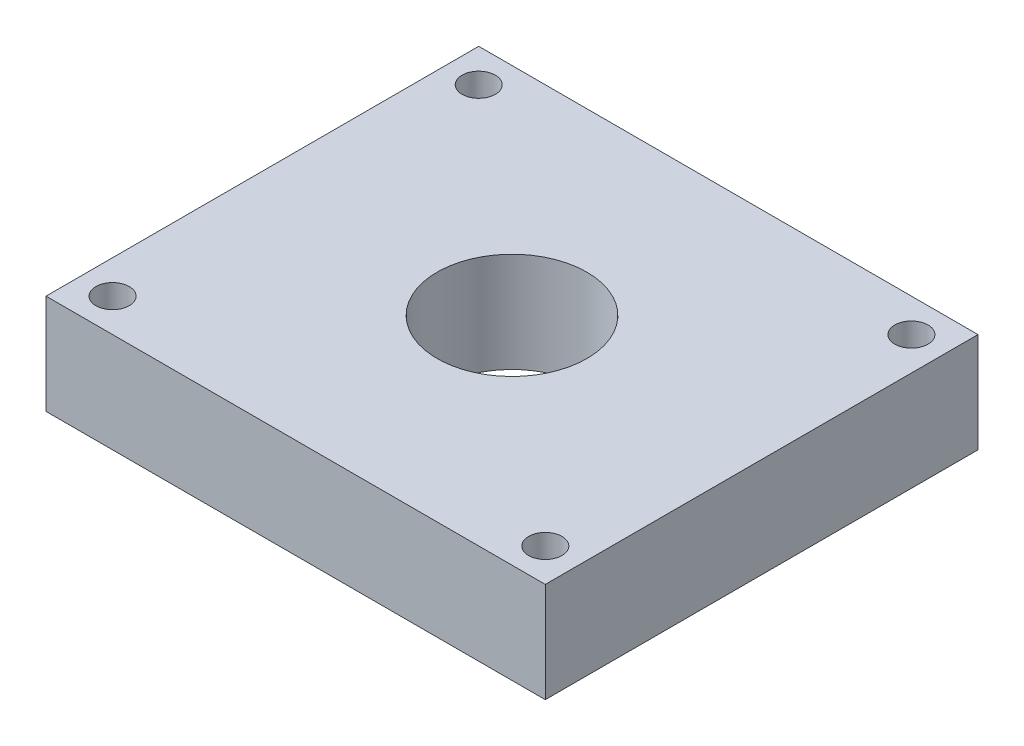
ISO-10303-21;
HEADER;
FILE_DESCRIPTION(('STEP AP214'),'2;1');
FILE_NAME('part.step','',(''),(''),'','','');
FILE_SCHEMA(('AUTOMOTIVE_DESIGN { 1 0 10303 214 1 1 1 1 }'));
ENDSEC;
DATA;
#1=APPLICATION_CONTEXT('core data for automotive mechanical design processes');
#2=APPLICATION_PROTOCOL_DEFINITION('international standard','automotive_design',2000,#1);
#3=PRODUCT_CONTEXT('',#1,'mechanical');
#4=PRODUCT('Part','Part','',(#3));
#5=PRODUCT_RELATED_PRODUCT_CATEGORY('part','',(#4));
#6=PRODUCT_DEFINITION_FORMATION('','',#4);
#7=PRODUCT_DEFINITION_CONTEXT('part definition',#1,'design');
#8=PRODUCT_DEFINITION('design','',#6,#7);
#9=PRODUCT_DEFINITION_SHAPE('','',#8);
#10=(LENGTH_UNIT() NAMED_UNIT(*) SI_UNIT(.MILLI.,.METRE.));
#11=(NAMED_UNIT(*) PLANE_ANGLE_UNIT() SI_UNIT($,.RADIAN.));
#12=(NAMED_UNIT(*) SI_UNIT($,.STERADIAN.) SOLID_ANGLE_UNIT());
#13=UNCERTAINTY_MEASURE_WITH_UNIT(LENGTH_MEASURE(1.E-05),#10,'distance_accuracy_value','');
#14=(GEOMETRIC_REPRESENTATION_CONTEXT(3) GLOBAL_UNCERTAINTY_ASSIGNED_CONTEXT((#13)) GLOBAL_UNIT_ASSIGNED_CONTEXT((#10,
#11,#12)) REPRESENTATION_CONTEXT('',''));
#15=CARTESIAN_POINT('',(0.,0.,0.));
#16=DIRECTION('',(0.,0.,1.));
#17=DIRECTION('',(1.,0.,0.));
#18=AXIS2_PLACEMENT_3D('',#15,#16,#17);
#19=CARTESIAN_POINT('',(0.,19.05,0.));
#20=DIRECTION('',(0.,-1.,0.));
#21=DIRECTION('',(0.,0.,-1.));
#22=AXIS2_PLACEMENT_3D('',#19,#20,#21);
#23=PLANE('',#22);
#24=DIRECTION('',(0.,0.,-1.));
#25=VECTOR('',#24,1.);
#26=CARTESIAN_POINT('',(47.625,19.05,41.275));
#27=LINE('',#26,#25);
#28=CARTESIAN_POINT('',(47.625,19.05,41.275));
#29=VERTEX_POINT('',#28);
#30=CARTESIAN_POINT('',(47.625,19.05,-41.275));
#31=VERTEX_POINT('',#30);
#32=EDGE_CURVE('E89',#29,#31,#27,.T.);
#33=ORIENTED_EDGE('',*,*,#32,.T.);
#34=DIRECTION('',(-1.,0.,0.));
#35=VECTOR('',#34,1.);
#36=CARTESIAN_POINT('',(-47.625,19.05,-41.275));
#37=LINE('',#36,#35);
#38=CARTESIAN_POINT('',(-47.625,19.05,-41.275));
#39=VERTEX_POINT('',#38);
#40=EDGE_CURVE('E84',#31,#39,#37,.T.);
#41=ORIENTED_EDGE('',*,*,#40,.T.);
#42=DIRECTION('',(0.,0.,1.));
#43=VECTOR('',#42,1.);
#44=CARTESIAN_POINT('',(-47.625,19.05,41.275));
#45=LINE('',#44,#43);
#46=CARTESIAN_POINT('',(-47.625,19.05,41.275));
#47=VERTEX_POINT('',#46);
#48=EDGE_CURVE('E87',#39,#47,#45,.T.);
#49=ORIENTED_EDGE('',*,*,#48,.T.);
#50=DIRECTION('',(1.,0.,0.));
#51=VECTOR('',#50,1.);
#52=CARTESIAN_POINT('',(-47.625,19.05,41.275));
#53=LINE('',#52,#51);
#54=EDGE_CURVE('E54',#47,#29,#53,.T.);
#55=ORIENTED_EDGE('',*,*,#54,.T.);
#56=EDGE_LOOP('',(#33,#41,#49,#55));
#57=FACE_BOUND('',#56,.T.);
#58=CARTESIAN_POINT('',(0.,19.05,0.));
#59=DIRECTION('',(0.,1.,0.));
#60=DIRECTION('',(0.,0.,1.));
#61=AXIS2_PLACEMENT_3D('',#58,#59,#60);
#62=CIRCLE('',#61,14.2875);
#63=CARTESIAN_POINT('',(0.,19.05,-14.2875));
#64=VERTEX_POINT('',#63);
#65=EDGE_CURVE('E104',#64,#64,#62,.T.);
#66=ORIENTED_EDGE('',*,*,#65,.F.);
#67=EDGE_LOOP('',(#66));
#68=FACE_BOUND('',#67,.T.);
#69=CARTESIAN_POINT('',(-41.275,19.05,-34.925));
#70=DIRECTION('',(0.,1.,0.));
#71=DIRECTION('',(0.,0.,-1.));
#72=AXIS2_PLACEMENT_3D('',#69,#70,#71);
#73=CIRCLE('',#72,3.17500000000001);
#74=CARTESIAN_POINT('',(-41.275,19.05,-38.1));
#75=VERTEX_POINT('',#74);
#76=EDGE_CURVE('E119',#75,#75,#73,.T.);
#77=ORIENTED_EDGE('',*,*,#76,.F.);
#78=EDGE_LOOP('',(#77));
#79=FACE_BOUND('',#78,.T.);
#80=CARTESIAN_POINT('',(-41.275,19.05,34.925));
#81=DIRECTION('',(0.,1.,0.));
#82=DIRECTION('',(0.,0.,1.));
#83=AXIS2_PLACEMENT_3D('',#80,#81,#82);
#84=CIRCLE('',#83,3.17500000000001);
#85=CARTESIAN_POINT('',(-41.275,19.05,31.75));
#86=VERTEX_POINT('',#85);
#87=EDGE_CURVE('E125',#86,#86,#84,.T.);
#88=ORIENTED_EDGE('',*,*,#87,.F.);
#89=EDGE_LOOP('',(#88));
#90=FACE_BOUND('',#89,.T.);
#91=CARTESIAN_POINT('',(41.275,19.05,-34.925));
#92=DIRECTION('',(0.,1.,0.));
#93=DIRECTION('',(0.,0.,1.));
#94=AXIS2_PLACEMENT_3D('',#91,#92,#93);
#95=CIRCLE('',#94,3.17500000000001);
#96=CARTESIAN_POINT('',(41.275,19.05,-38.1));
#97=VERTEX_POINT('',#96);
#98=EDGE_CURVE('E131',#97,#97,#95,.T.);
#99=ORIENTED_EDGE('',*,*,#98,.F.);
#100=EDGE_LOOP('',(#99));
#101=FACE_BOUND('',#100,.T.);
#102=CARTESIAN_POINT('',(41.275,19.05,34.925));
#103=DIRECTION('',(0.,1.,0.));
#104=DIRECTION('',(0.,0.,-1.));
#105=AXIS2_PLACEMENT_3D('',#102,#103,#104);
#106=CIRCLE('',#105,3.17500000000001);
#107=CARTESIAN_POINT('',(41.275,19.05,31.75));
#108=VERTEX_POINT('',#107);
#109=EDGE_CURVE('E137',#108,#108,#106,.T.);
#110=ORIENTED_EDGE('',*,*,#109,.F.);
#111=EDGE_LOOP('',(#110));
#112=FACE_BOUND('',#111,.T.);
#113=ADVANCED_FACE('F37',(#57,#68,#79,#90,#101,#112),#23,.F.);
#114=CARTESIAN_POINT('',(0.,0.,0.));
#115=DIRECTION('',(0.,-1.,0.));
#116=DIRECTION('',(0.,0.,-1.));
#117=AXIS2_PLACEMENT_3D('',#114,#115,#116);
#118=PLANE('',#117);
#119=CARTESIAN_POINT('',(41.275,0.,-34.925));
#120=DIRECTION('',(0.,1.,0.));
#121=DIRECTION('',(0.,0.,1.));
#122=AXIS2_PLACEMENT_3D('',#119,#120,#121);
#123=CIRCLE('',#122,3.17500000000001);
#124=CARTESIAN_POINT('',(41.275,0.,-38.1));
#125=VERTEX_POINT('',#124);
#126=EDGE_CURVE('E134',#125,#125,#123,.T.);
#127=ORIENTED_EDGE('',*,*,#126,.T.);
#128=EDGE_LOOP('',(#127));
#129=FACE_BOUND('',#128,.T.);
#130=CARTESIAN_POINT('',(-41.275,0.,-34.925));
#131=DIRECTION('',(0.,1.,0.));
#132=DIRECTION('',(0.,0.,-1.));
#133=AXIS2_PLACEMENT_3D('',#130,#131,#132);
#134=CIRCLE('',#133,3.17500000000001);
#135=CARTESIAN_POINT('',(-41.275,0.,-38.1));
#136=VERTEX_POINT('',#135);
#137=EDGE_CURVE('E122',#136,#136,#134,.T.);
#138=ORIENTED_EDGE('',*,*,#137,.T.);
#139=EDGE_LOOP('',(#138));
#140=FACE_BOUND('',#139,.T.);
#141=DIRECTION('',(0.,0.,-1.));
#142=VECTOR('',#141,1.);
#143=CARTESIAN_POINT('',(47.625,0.,41.275));
#144=LINE('',#143,#142);
#145=CARTESIAN_POINT('',(47.625,0.,41.275));
#146=VERTEX_POINT('',#145);
#147=CARTESIAN_POINT('',(47.625,0.,-41.275));
#148=VERTEX_POINT('',#147);
#149=EDGE_CURVE('E101',#146,#148,#144,.T.);
#150=ORIENTED_EDGE('',*,*,#149,.F.);
#151=DIRECTION('',(1.,0.,0.));
#152=VECTOR('',#151,1.);
#153=CARTESIAN_POINT('',(-47.625,0.,41.275));
#154=LINE('',#153,#152);
#155=CARTESIAN_POINT('',(-47.625,0.,41.275));
#156=VERTEX_POINT('',#155);
#157=EDGE_CURVE('E77',#156,#146,#154,.T.);
#158=ORIENTED_EDGE('',*,*,#157,.F.);
#159=DIRECTION('',(0.,0.,1.));
#160=VECTOR('',#159,1.);
#161=CARTESIAN_POINT('',(-47.625,0.,41.275));
#162=LINE('',#161,#160);
#163=CARTESIAN_POINT('',(-47.625,0.,-41.275));
#164=VERTEX_POINT('',#163);
#165=EDGE_CURVE('E71',#164,#156,#162,.T.);
#166=ORIENTED_EDGE('',*,*,#165,.F.);
#167=DIRECTION('',(-1.,0.,0.));
#168=VECTOR('',#167,1.);
#169=CARTESIAN_POINT('',(-47.625,0.,-41.275));
#170=LINE('',#169,#168);
#171=EDGE_CURVE('E93',#148,#164,#170,.T.);
#172=ORIENTED_EDGE('',*,*,#171,.F.);
#173=EDGE_LOOP('',(#150,#158,#166,#172));
#174=FACE_BOUND('',#173,.T.);
#175=CARTESIAN_POINT('',(0.,0.,0.));
#176=DIRECTION('',(0.,1.,0.));
#177=DIRECTION('',(0.,0.,1.));
#178=AXIS2_PLACEMENT_3D('',#175,#176,#177);
#179=CIRCLE('',#178,14.2875);
#180=CARTESIAN_POINT('',(0.,0.,-14.2875));
#181=VERTEX_POINT('',#180);
#182=EDGE_CURVE('E116',#181,#181,#179,.T.);
#183=ORIENTED_EDGE('',*,*,#182,.T.);
#184=EDGE_LOOP('',(#183));
#185=FACE_BOUND('',#184,.T.);
#186=CARTESIAN_POINT('',(-41.275,0.,34.925));
#187=DIRECTION('',(0.,1.,0.));
#188=DIRECTION('',(0.,0.,1.));
#189=AXIS2_PLACEMENT_3D('',#186,#187,#188);
#190=CIRCLE('',#189,3.17500000000001);
#191=CARTESIAN_POINT('',(-41.275,0.,31.75));
#192=VERTEX_POINT('',#191);
#193=EDGE_CURVE('E128',#192,#192,#190,.T.);
#194=ORIENTED_EDGE('',*,*,#193,.T.);
#195=EDGE_LOOP('',(#194));
#196=FACE_BOUND('',#195,.T.);
#197=CARTESIAN_POINT('',(41.275,0.,34.925));
#198=DIRECTION('',(0.,1.,0.));
#199=DIRECTION('',(0.,0.,-1.));
#200=AXIS2_PLACEMENT_3D('',#197,#198,#199);
#201=CIRCLE('',#200,3.17500000000001);
#202=CARTESIAN_POINT('',(41.275,0.,31.75));
#203=VERTEX_POINT('',#202);
#204=EDGE_CURVE('E140',#203,#203,#201,.T.);
#205=ORIENTED_EDGE('',*,*,#204,.T.);
#206=EDGE_LOOP('',(#205));
#207=FACE_BOUND('',#206,.T.);
#208=ADVANCED_FACE('F112',(#129,#140,#174,#185,#196,#207),#118,.T.);
#209=CARTESIAN_POINT('',(47.625,19.05,41.275));
#210=DIRECTION('',(-1.,0.,0.));
#211=DIRECTION('',(0.,0.,1.));
#212=AXIS2_PLACEMENT_3D('',#209,#210,#211);
#213=PLANE('',#212);
#214=ORIENTED_EDGE('',*,*,#149,.T.);
#215=DIRECTION('',(0.,-1.,0.));
#216=VECTOR('',#215,1.);
#217=CARTESIAN_POINT('',(47.625,19.05,-41.275));
#218=LINE('',#217,#216);
#219=EDGE_CURVE('E11',#31,#148,#218,.T.);
#220=ORIENTED_EDGE('',*,*,#219,.F.);
#221=ORIENTED_EDGE('',*,*,#32,.F.);
#222=DIRECTION('',(0.,-1.,0.));
#223=VECTOR('',#222,1.);
#224=CARTESIAN_POINT('',(47.625,19.05,41.275));
#225=LINE('',#224,#223);
#226=EDGE_CURVE('E97',#29,#146,#225,.T.);
#227=ORIENTED_EDGE('',*,*,#226,.T.);
#228=EDGE_LOOP('',(#214,#220,#221,#227));
#229=FACE_BOUND('',#228,.T.);
#230=ADVANCED_FACE('F39',(#229),#213,.F.);
#231=CARTESIAN_POINT('',(-47.625,19.05,-41.275));
#232=DIRECTION('',(0.,0.,1.));
#233=DIRECTION('',(1.,0.,0.));
#234=AXIS2_PLACEMENT_3D('',#231,#232,#233);
#235=PLANE('',#234);
#236=ORIENTED_EDGE('',*,*,#171,.T.);
#237=DIRECTION('',(0.,-1.,0.));
#238=VECTOR('',#237,1.);
#239=CARTESIAN_POINT('',(-47.625,19.05,-41.275));
#240=LINE('',#239,#238);
#241=EDGE_CURVE('E46',#39,#164,#240,.T.);
#242=ORIENTED_EDGE('',*,*,#241,.F.);
#243=ORIENTED_EDGE('',*,*,#40,.F.);
#244=ORIENTED_EDGE('',*,*,#219,.T.);
#245=EDGE_LOOP('',(#236,#242,#243,#244));
#246=FACE_BOUND('',#245,.T.);
#247=ADVANCED_FACE('F92',(#246),#235,.F.);
#248=CARTESIAN_POINT('',(-47.625,19.05,41.275));
#249=DIRECTION('',(1.,0.,0.));
#250=DIRECTION('',(0.,0.,-1.));
#251=AXIS2_PLACEMENT_3D('',#248,#249,#250);
#252=PLANE('',#251);
#253=ORIENTED_EDGE('',*,*,#165,.T.);
#254=DIRECTION('',(0.,-1.,0.));
#255=VECTOR('',#254,1.);
#256=CARTESIAN_POINT('',(-47.625,19.05,41.275));
#257=LINE('',#256,#255);
#258=EDGE_CURVE('E94',#47,#156,#257,.T.);
#259=ORIENTED_EDGE('',*,*,#258,.F.);
#260=ORIENTED_EDGE('',*,*,#48,.F.);
#261=ORIENTED_EDGE('',*,*,#241,.T.);
#262=EDGE_LOOP('',(#253,#259,#260,#261));
#263=FACE_BOUND('',#262,.T.);
#264=ADVANCED_FACE('F95',(#263),#252,.F.);
#265=CARTESIAN_POINT('',(-47.625,19.05,41.275));
#266=DIRECTION('',(0.,0.,-1.));
#267=DIRECTION('',(-1.,0.,0.));
#268=AXIS2_PLACEMENT_3D('',#265,#266,#267);
#269=PLANE('',#268);
#270=ORIENTED_EDGE('',*,*,#157,.T.);
#271=ORIENTED_EDGE('',*,*,#226,.F.);
#272=ORIENTED_EDGE('',*,*,#54,.F.);
#273=ORIENTED_EDGE('',*,*,#258,.T.);
#274=EDGE_LOOP('',(#270,#271,#272,#273));
#275=FACE_BOUND('',#274,.T.);
#276=ADVANCED_FACE('F109',(#275),#269,.F.);
#277=CARTESIAN_POINT('',(0.,19.05,0.));
#278=DIRECTION('',(0.,-1.,0.));
#279=DIRECTION('',(0.,0.,-1.));
#280=AXIS2_PLACEMENT_3D('',#277,#278,#279);
#281=CYLINDRICAL_SURFACE('',#280,14.2875);
#282=CARTESIAN_POINT('',(0.,19.05,-14.2875));
#283=CARTESIAN_POINT('',(0.,18.8515625,-14.2875));
#284=CARTESIAN_POINT('',(0.,18.653125,-14.2875));
#285=CARTESIAN_POINT('',(0.,18.25625,-14.2875));
#286=CARTESIAN_POINT('',(0.,18.0578125,-14.2875));
#287=CARTESIAN_POINT('',(0.,17.6609375,-14.2875));
#288=CARTESIAN_POINT('',(0.,17.4625,-14.2875));
#289=CARTESIAN_POINT('',(0.,17.065625,-14.2875));
#290=CARTESIAN_POINT('',(0.,16.8671875,-14.2875));
#291=CARTESIAN_POINT('',(0.,16.4703125,-14.2875));
#292=CARTESIAN_POINT('',(0.,16.271875,-14.2875));
#293=CARTESIAN_POINT('',(0.,15.875,-14.2875));
#294=CARTESIAN_POINT('',(0.,15.6765625,-14.2875));
#295=CARTESIAN_POINT('',(0.,15.2796875,-14.2875));
#296=CARTESIAN_POINT('',(0.,15.08125,-14.2875));
#297=CARTESIAN_POINT('',(0.,14.684375,-14.2875));
#298=CARTESIAN_POINT('',(0.,14.4859375,-14.2875));
#299=CARTESIAN_POINT('',(0.,14.0890625,-14.2875));
#300=CARTESIAN_POINT('',(0.,13.890625,-14.2875));
#301=CARTESIAN_POINT('',(0.,13.49375,-14.2875));
#302=CARTESIAN_POINT('',(0.,13.2953125,-14.2875));
#303=CARTESIAN_POINT('',(0.,12.8984375,-14.2875));
#304=CARTESIAN_POINT('',(0.,12.7,-14.2875));
#305=CARTESIAN_POINT('',(0.,12.303125,-14.2875));
#306=CARTESIAN_POINT('',(0.,12.1046875,-14.2875));
#307=CARTESIAN_POINT('',(0.,11.7078125,-14.2875));
#308=CARTESIAN_POINT('',(0.,11.509375,-14.2875));
#309=CARTESIAN_POINT('',(0.,11.1125,-14.2875));
#310=CARTESIAN_POINT('',(0.,10.9140625,-14.2875));
#311=CARTESIAN_POINT('',(0.,10.5171875,-14.2875));
#312=CARTESIAN_POINT('',(0.,10.31875,-14.2875));
#313=CARTESIAN_POINT('',(0.,9.921875,-14.2875));
#314=CARTESIAN_POINT('',(0.,9.7234375,-14.2875));
#315=CARTESIAN_POINT('',(0.,9.3265625,-14.2875));
#316=CARTESIAN_POINT('',(0.,9.128125,-14.2875));
#317=CARTESIAN_POINT('',(0.,8.73125,-14.2875));
#318=CARTESIAN_POINT('',(0.,8.5328125,-14.2875));
#319=CARTESIAN_POINT('',(0.,8.1359375,-14.2875));
#320=CARTESIAN_POINT('',(0.,7.9375,-14.2875));
#321=CARTESIAN_POINT('',(0.,7.540625,-14.2875));
#322=CARTESIAN_POINT('',(0.,7.3421875,-14.2875));
#323=CARTESIAN_POINT('',(0.,6.9453125,-14.2875));
#324=CARTESIAN_POINT('',(0.,6.746875,-14.2875));
#325=CARTESIAN_POINT('',(0.,6.35,-14.2875));
#326=CARTESIAN_POINT('',(0.,6.1515625,-14.2875));
#327=CARTESIAN_POINT('',(0.,5.7546875,-14.2875));
#328=CARTESIAN_POINT('',(0.,5.55625,-14.2875));
#329=CARTESIAN_POINT('',(0.,5.159375,-14.2875));
#330=CARTESIAN_POINT('',(0.,4.9609375,-14.2875));
#331=CARTESIAN_POINT('',(0.,4.5640625,-14.2875));
#332=CARTESIAN_POINT('',(0.,4.365625,-14.2875));
#333=CARTESIAN_POINT('',(0.,3.96875,-14.2875));
#334=CARTESIAN_POINT('',(0.,3.7703125,-14.2875));
#335=CARTESIAN_POINT('',(0.,3.3734375,-14.2875));
#336=CARTESIAN_POINT('',(0.,3.175,-14.2875));
#337=CARTESIAN_POINT('',(0.,2.778125,-14.2875));
#338=CARTESIAN_POINT('',(0.,2.5796875,-14.2875));
#339=CARTESIAN_POINT('',(0.,2.1828125,-14.2875));
#340=CARTESIAN_POINT('',(0.,1.984375,-14.2875));
#341=CARTESIAN_POINT('',(0.,1.5875,-14.2875));
#342=CARTESIAN_POINT('',(0.,1.3890625,-14.2875));
#343=CARTESIAN_POINT('',(0.,0.992187500000001,-14.2875));
#344=CARTESIAN_POINT('',(0.,0.793750000000001,-14.2875));
#345=CARTESIAN_POINT('',(0.,0.396875,-14.2875));
#346=CARTESIAN_POINT('',(0.,0.1984375,-14.2875));
#347=CARTESIAN_POINT('',(0.,0.,-14.2875));
#348=B_SPLINE_CURVE_WITH_KNOTS('',3,(#282,#283,#284,#285,#286,#287,#288,#289,#290,#291,#292,
#293,#294,#295,#296,#297,#298,#299,#300,#301,#302,#303,#304,#305,#306,#307,#308,#309,#310,#311,
#312,#313,#314,#315,#316,#317,#318,#319,#320,#321,#322,#323,#324,#325,#326,#327,#328,#329,#330,
#331,#332,#333,#334,#335,#336,#337,#338,#339,#340,#341,#342,#343,#344,#345,#346,#347),
.UNSPECIFIED.,.F.,.F.,(4,2,2,2,2,2,2,2,2,2,2,2,2,2,2,2,2,2,2,2,2,2,2,2,2,2,2,2,2,2,2,2,4),(0.,
0.5953125,1.190625,1.7859375,2.38125,2.9765625,3.571875,4.1671875,4.7625,5.3578125,5.953125,
6.5484375,7.14375,7.7390625,8.334375,8.9296875,9.525,10.1203125,10.715625,11.3109375,11.90625,
12.5015625,13.096875,13.6921875,14.2875,14.8828125,15.478125,16.0734375,16.66875,17.2640625,
17.859375,18.4546875,19.05),.UNSPECIFIED.);
#349=EDGE_CURVE('BSEAM157',#64,#181,#348,.T.);
#350=ORIENTED_EDGE('',*,*,#65,.T.);
#351=ORIENTED_EDGE('',*,*,#182,.F.);
#352=ORIENTED_EDGE('',*,*,#349,.T.);
#353=ORIENTED_EDGE('',*,*,#349,.F.);
#354=EDGE_LOOP('',(#350,#352,#351,#353));
#355=FACE_BOUND('',#354,.T.);
#356=ADVANCED_FACE('F157',(#355),#281,.F.);
#357=CARTESIAN_POINT('',(-41.275,19.05,-34.925));
#358=DIRECTION('',(0.,-1.,0.));
#359=DIRECTION('',(0.,0.,-1.));
#360=AXIS2_PLACEMENT_3D('',#357,#358,#359);
#361=CYLINDRICAL_SURFACE('',#360,3.17500000000001);
#362=CARTESIAN_POINT('',(-41.275,19.05,-38.1));
#363=CARTESIAN_POINT('',(-41.275,18.8515625,-38.1));
#364=CARTESIAN_POINT('',(-41.275,18.653125,-38.1));
#365=CARTESIAN_POINT('',(-41.275,18.25625,-38.1));
#366=CARTESIAN_POINT('',(-41.275,18.0578125,-38.1));
#367=CARTESIAN_POINT('',(-41.275,17.6609375,-38.1));
#368=CARTESIAN_POINT('',(-41.275,17.4625,-38.1));
#369=CARTESIAN_POINT('',(-41.275,17.065625,-38.1));
#370=CARTESIAN_POINT('',(-41.275,16.8671875,-38.1));
#371=CARTESIAN_POINT('',(-41.275,16.4703125,-38.1));
#372=CARTESIAN_POINT('',(-41.275,16.271875,-38.1));
#373=CARTESIAN_POINT('',(-41.275,15.875,-38.1));
#374=CARTESIAN_POINT('',(-41.275,15.6765625,-38.1));
#375=CARTESIAN_POINT('',(-41.275,15.2796875,-38.1));
#376=CARTESIAN_POINT('',(-41.275,15.08125,-38.1));
#377=CARTESIAN_POINT('',(-41.275,14.684375,-38.1));
#378=CARTESIAN_POINT('',(-41.275,14.4859375,-38.1));
#379=CARTESIAN_POINT('',(-41.275,14.0890625,-38.1));
#380=CARTESIAN_POINT('',(-41.275,13.890625,-38.1));
#381=CARTESIAN_POINT('',(-41.275,13.49375,-38.1));
#382=CARTESIAN_POINT('',(-41.275,13.2953125,-38.1));
#383=CARTESIAN_POINT('',(-41.275,12.8984375,-38.1));
#384=CARTESIAN_POINT('',(-41.275,12.7,-38.1));
#385=CARTESIAN_POINT('',(-41.275,12.303125,-38.1));
#386=CARTESIAN_POINT('',(-41.275,12.1046875,-38.1));
#387=CARTESIAN_POINT('',(-41.275,11.7078125,-38.1));
#388=CARTESIAN_POINT('',(-41.275,11.509375,-38.1));
#389=CARTESIAN_POINT('',(-41.275,11.1125,-38.1));
#390=CARTESIAN_POINT('',(-41.275,10.9140625,-38.1));
#391=CARTESIAN_POINT('',(-41.275,10.5171875,-38.1));
#392=CARTESIAN_POINT('',(-41.275,10.31875,-38.1));
#393=CARTESIAN_POINT('',(-41.275,9.921875,-38.1));
#394=CARTESIAN_POINT('',(-41.275,9.7234375,-38.1));
#395=CARTESIAN_POINT('',(-41.275,9.3265625,-38.1));
#396=CARTESIAN_POINT('',(-41.275,9.128125,-38.1));
#397=CARTESIAN_POINT('',(-41.275,8.73125,-38.1));
#398=CARTESIAN_POINT('',(-41.275,8.5328125,-38.1));
#399=CARTESIAN_POINT('',(-41.275,8.1359375,-38.1));
#400=CARTESIAN_POINT('',(-41.275,7.9375,-38.1));
#401=CARTESIAN_POINT('',(-41.275,7.540625,-38.1));
#402=CARTESIAN_POINT('',(-41.275,7.3421875,-38.1));
#403=CARTESIAN_POINT('',(-41.275,6.9453125,-38.1));
#404=CARTESIAN_POINT('',(-41.275,6.746875,-38.1));
#405=CARTESIAN_POINT('',(-41.275,6.35,-38.1));
#406=CARTESIAN_POINT('',(-41.275,6.1515625,-38.1));
#407=CARTESIAN_POINT('',(-41.275,5.7546875,-38.1));
#408=CARTESIAN_POINT('',(-41.275,5.55625,-38.1));
#409=CARTESIAN_POINT('',(-41.275,5.159375,-38.1));
#410=CARTESIAN_POINT('',(-41.275,4.9609375,-38.1));
#411=CARTESIAN_POINT('',(-41.275,4.5640625,-38.1));
#412=CARTESIAN_POINT('',(-41.275,4.365625,-38.1));
#413=CARTESIAN_POINT('',(-41.275,3.96875,-38.1));
#414=CARTESIAN_POINT('',(-41.275,3.7703125,-38.1));
#415=CARTESIAN_POINT('',(-41.275,3.3734375,-38.1));
#416=CARTESIAN_POINT('',(-41.275,3.175,-38.1));
#417=CARTESIAN_POINT('',(-41.275,2.778125,-38.1));
#418=CARTESIAN_POINT('',(-41.275,2.5796875,-38.1));
#419=CARTESIAN_POINT('',(-41.275,2.1828125,-38.1));
#420=CARTESIAN_POINT('',(-41.275,1.984375,-38.1));
#421=CARTESIAN_POINT('',(-41.275,1.5875,-38.1));
#422=CARTESIAN_POINT('',(-41.275,1.3890625,-38.1));
#423=CARTESIAN_POINT('',(-41.275,0.992187500000001,-38.1));
#424=CARTESIAN_POINT('',(-41.275,0.793750000000001,-38.1));
#425=CARTESIAN_POINT('',(-41.275,0.396875,-38.1));
#426=CARTESIAN_POINT('',(-41.275,0.1984375,-38.1));
#427=CARTESIAN_POINT('',(-41.275,0.,-38.1));
#428=B_SPLINE_CURVE_WITH_KNOTS('',3,(#362,#363,#364,#365,#366,#367,#368,#369,#370,#371,#372,
#373,#374,#375,#376,#377,#378,#379,#380,#381,#382,#383,#384,#385,#386,#387,#388,#389,#390,#391,
#392,#393,#394,#395,#396,#397,#398,#399,#400,#401,#402,#403,#404,#405,#406,#407,#408,#409,#410,
#411,#412,#413,#414,#415,#416,#417,#418,#419,#420,#421,#422,#423,#424,#425,#426,#427),
.UNSPECIFIED.,.F.,.F.,(4,2,2,2,2,2,2,2,2,2,2,2,2,2,2,2,2,2,2,2,2,2,2,2,2,2,2,2,2,2,2,2,4),(0.,
0.595312499999997,1.190625,1.7859375,2.38125,2.9765625,3.571875,4.1671875,4.7625,5.3578125,
5.953125,6.5484375,7.14375,7.7390625,8.334375,8.9296875,9.525,10.1203125,10.715625,11.3109375,
11.90625,12.5015625,13.096875,13.6921875,14.2875,14.8828125,15.478125,16.0734375,16.66875,
17.2640625,17.859375,18.4546875,19.05),.UNSPECIFIED.);
#429=EDGE_CURVE('BSEAM192',#75,#136,#428,.T.);
#430=ORIENTED_EDGE('',*,*,#76,.T.);
#431=ORIENTED_EDGE('',*,*,#137,.F.);
#432=ORIENTED_EDGE('',*,*,#429,.T.);
#433=ORIENTED_EDGE('',*,*,#429,.F.);
#434=EDGE_LOOP('',(#430,#432,#431,#433));
#435=FACE_BOUND('',#434,.T.);
#436=ADVANCED_FACE('F192',(#435),#361,.F.);
#437=CARTESIAN_POINT('',(-41.275,19.05,34.925));
#438=DIRECTION('',(0.,-1.,0.));
#439=DIRECTION('',(0.,0.,-1.));
#440=AXIS2_PLACEMENT_3D('',#437,#438,#439);
#441=CYLINDRICAL_SURFACE('',#440,3.17500000000001);
#442=CARTESIAN_POINT('',(-41.275,19.05,31.75));
#443=CARTESIAN_POINT('',(-41.275,18.8515625,31.75));
#444=CARTESIAN_POINT('',(-41.275,18.653125,31.75));
#445=CARTESIAN_POINT('',(-41.275,18.25625,31.75));
#446=CARTESIAN_POINT('',(-41.275,18.0578125,31.75));
#447=CARTESIAN_POINT('',(-41.275,17.6609375,31.75));
#448=CARTESIAN_POINT('',(-41.275,17.4625,31.75));
#449=CARTESIAN_POINT('',(-41.275,17.065625,31.75));
#450=CARTESIAN_POINT('',(-41.275,16.8671875,31.75));
#451=CARTESIAN_POINT('',(-41.275,16.4703125,31.75));
#452=CARTESIAN_POINT('',(-41.275,16.271875,31.75));
#453=CARTESIAN_POINT('',(-41.275,15.875,31.75));
#454=CARTESIAN_POINT('',(-41.275,15.6765625,31.75));
#455=CARTESIAN_POINT('',(-41.275,15.2796875,31.75));
#456=CARTESIAN_POINT('',(-41.275,15.08125,31.75));
#457=CARTESIAN_POINT('',(-41.275,14.684375,31.75));
#458=CARTESIAN_POINT('',(-41.275,14.4859375,31.75));
#459=CARTESIAN_POINT('',(-41.275,14.0890625,31.75));
#460=CARTESIAN_POINT('',(-41.275,13.890625,31.75));
#461=CARTESIAN_POINT('',(-41.275,13.49375,31.75));
#462=CARTESIAN_POINT('',(-41.275,13.2953125,31.75));
#463=CARTESIAN_POINT('',(-41.275,12.8984375,31.75));
#464=CARTESIAN_POINT('',(-41.275,12.7,31.75));
#465=CARTESIAN_POINT('',(-41.275,12.303125,31.75));
#466=CARTESIAN_POINT('',(-41.275,12.1046875,31.75));
#467=CARTESIAN_POINT('',(-41.275,11.7078125,31.75));
#468=CARTESIAN_POINT('',(-41.275,11.509375,31.75));
#469=CARTESIAN_POINT('',(-41.275,11.1125,31.75));
#470=CARTESIAN_POINT('',(-41.275,10.9140625,31.75));
#471=CARTESIAN_POINT('',(-41.275,10.5171875,31.75));
#472=CARTESIAN_POINT('',(-41.275,10.31875,31.75));
#473=CARTESIAN_POINT('',(-41.275,9.921875,31.75));
#474=CARTESIAN_POINT('',(-41.275,9.7234375,31.75));
#475=CARTESIAN_POINT('',(-41.275,9.3265625,31.75));
#476=CARTESIAN_POINT('',(-41.275,9.128125,31.75));
#477=CARTESIAN_POINT('',(-41.275,8.73125,31.75));
#478=CARTESIAN_POINT('',(-41.275,8.5328125,31.75));
#479=CARTESIAN_POINT('',(-41.275,8.1359375,31.75));
#480=CARTESIAN_POINT('',(-41.275,7.9375,31.75));
#481=CARTESIAN_POINT('',(-41.275,7.540625,31.75));
#482=CARTESIAN_POINT('',(-41.275,7.3421875,31.75));
#483=CARTESIAN_POINT('',(-41.275,6.9453125,31.75));
#484=CARTESIAN_POINT('',(-41.275,6.746875,31.75));
#485=CARTESIAN_POINT('',(-41.275,6.35,31.75));
#486=CARTESIAN_POINT('',(-41.275,6.1515625,31.75));
#487=CARTESIAN_POINT('',(-41.275,5.7546875,31.75));
#488=CARTESIAN_POINT('',(-41.275,5.55625,31.75));
#489=CARTESIAN_POINT('',(-41.275,5.159375,31.75));
#490=CARTESIAN_POINT('',(-41.275,4.9609375,31.75));
#491=CARTESIAN_POINT('',(-41.275,4.5640625,31.75));
#492=CARTESIAN_POINT('',(-41.275,4.365625,31.75));
#493=CARTESIAN_POINT('',(-41.275,3.96875,31.75));
#494=CARTESIAN_POINT('',(-41.275,3.7703125,31.75));
#495=CARTESIAN_POINT('',(-41.275,3.3734375,31.75));
#496=CARTESIAN_POINT('',(-41.275,3.175,31.75));
#497=CARTESIAN_POINT('',(-41.275,2.778125,31.75));
#498=CARTESIAN_POINT('',(-41.275,2.5796875,31.75));
#499=CARTESIAN_POINT('',(-41.275,2.1828125,31.75));
#500=CARTESIAN_POINT('',(-41.275,1.984375,31.75));
#501=CARTESIAN_POINT('',(-41.275,1.5875,31.75));
#502=CARTESIAN_POINT('',(-41.275,1.3890625,31.75));
#503=CARTESIAN_POINT('',(-41.275,0.992187500000001,31.75));
#504=CARTESIAN_POINT('',(-41.275,0.793750000000001,31.75));
#505=CARTESIAN_POINT('',(-41.275,0.396875,31.75));
#506=CARTESIAN_POINT('',(-41.275,0.1984375,31.75));
#507=CARTESIAN_POINT('',(-41.275,0.,31.75));
#508=B_SPLINE_CURVE_WITH_KNOTS('',3,(#442,#443,#444,#445,#446,#447,#448,#449,#450,#451,#452,
#453,#454,#455,#456,#457,#458,#459,#460,#461,#462,#463,#464,#465,#466,#467,#468,#469,#470,#471,
#472,#473,#474,#475,#476,#477,#478,#479,#480,#481,#482,#483,#484,#485,#486,#487,#488,#489,#490,
#491,#492,#493,#494,#495,#496,#497,#498,#499,#500,#501,#502,#503,#504,#505,#506,#507),
.UNSPECIFIED.,.F.,.F.,(4,2,2,2,2,2,2,2,2,2,2,2,2,2,2,2,2,2,2,2,2,2,2,2,2,2,2,2,2,2,2,2,4),(0.,
0.595312499999997,1.190625,1.7859375,2.38125,2.9765625,3.571875,4.1671875,4.7625,5.3578125,
5.953125,6.5484375,7.14375,7.7390625,8.334375,8.9296875,9.525,10.1203125,10.715625,11.3109375,
11.90625,12.5015625,13.096875,13.6921875,14.2875,14.8828125,15.478125,16.0734375,16.66875,
17.2640625,17.859375,18.4546875,19.05),.UNSPECIFIED.);
#509=EDGE_CURVE('BSEAM199',#86,#192,#508,.T.);
#510=ORIENTED_EDGE('',*,*,#87,.T.);
#511=ORIENTED_EDGE('',*,*,#193,.F.);
#512=ORIENTED_EDGE('',*,*,#509,.T.);
#513=ORIENTED_EDGE('',*,*,#509,.F.);
#514=EDGE_LOOP('',(#510,#512,#511,#513));
#515=FACE_BOUND('',#514,.T.);
#516=ADVANCED_FACE('F199',(#515),#441,.F.);
#517=CARTESIAN_POINT('',(41.275,19.05,-34.925));
#518=DIRECTION('',(0.,-1.,0.));
#519=DIRECTION('',(0.,0.,-1.));
#520=AXIS2_PLACEMENT_3D('',#517,#518,#519);
#521=CYLINDRICAL_SURFACE('',#520,3.17500000000001);
#522=CARTESIAN_POINT('',(41.275,19.05,-38.1));
#523=CARTESIAN_POINT('',(41.275,18.8515625,-38.1));
#524=CARTESIAN_POINT('',(41.275,18.653125,-38.1));
#525=CARTESIAN_POINT('',(41.275,18.25625,-38.1));
#526=CARTESIAN_POINT('',(41.275,18.0578125,-38.1));
#527=CARTESIAN_POINT('',(41.275,17.6609375,-38.1));
#528=CARTESIAN_POINT('',(41.275,17.4625,-38.1));
#529=CARTESIAN_POINT('',(41.275,17.065625,-38.1));
#530=CARTESIAN_POINT('',(41.275,16.8671875,-38.1));
#531=CARTESIAN_POINT('',(41.275,16.4703125,-38.1));
#532=CARTESIAN_POINT('',(41.275,16.271875,-38.1));
#533=CARTESIAN_POINT('',(41.275,15.875,-38.1));
#534=CARTESIAN_POINT('',(41.275,15.6765625,-38.1));
#535=CARTESIAN_POINT('',(41.275,15.2796875,-38.1));
#536=CARTESIAN_POINT('',(41.275,15.08125,-38.1));
#537=CARTESIAN_POINT('',(41.275,14.684375,-38.1));
#538=CARTESIAN_POINT('',(41.275,14.4859375,-38.1));
#539=CARTESIAN_POINT('',(41.275,14.0890625,-38.1));
#540=CARTESIAN_POINT('',(41.275,13.890625,-38.1));
#541=CARTESIAN_POINT('',(41.275,13.49375,-38.1));
#542=CARTESIAN_POINT('',(41.275,13.2953125,-38.1));
#543=CARTESIAN_POINT('',(41.275,12.8984375,-38.1));
#544=CARTESIAN_POINT('',(41.275,12.7,-38.1));
#545=CARTESIAN_POINT('',(41.275,12.303125,-38.1));
#546=CARTESIAN_POINT('',(41.275,12.1046875,-38.1));
#547=CARTESIAN_POINT('',(41.275,11.7078125,-38.1));
#548=CARTESIAN_POINT('',(41.275,11.509375,-38.1));
#549=CARTESIAN_POINT('',(41.275,11.1125,-38.1));
#550=CARTESIAN_POINT('',(41.275,10.9140625,-38.1));
#551=CARTESIAN_POINT('',(41.275,10.5171875,-38.1));
#552=CARTESIAN_POINT('',(41.275,10.31875,-38.1));
#553=CARTESIAN_POINT('',(41.275,9.921875,-38.1));
#554=CARTESIAN_POINT('',(41.275,9.7234375,-38.1));
#555=CARTESIAN_POINT('',(41.275,9.3265625,-38.1));
#556=CARTESIAN_POINT('',(41.275,9.128125,-38.1));
#557=CARTESIAN_POINT('',(41.275,8.73125,-38.1));
#558=CARTESIAN_POINT('',(41.275,8.5328125,-38.1));
#559=CARTESIAN_POINT('',(41.275,8.1359375,-38.1));
#560=CARTESIAN_POINT('',(41.275,7.9375,-38.1));
#561=CARTESIAN_POINT('',(41.275,7.540625,-38.1));
#562=CARTESIAN_POINT('',(41.275,7.3421875,-38.1));
#563=CARTESIAN_POINT('',(41.275,6.9453125,-38.1));
#564=CARTESIAN_POINT('',(41.275,6.746875,-38.1));
#565=CARTESIAN_POINT('',(41.275,6.35,-38.1));
#566=CARTESIAN_POINT('',(41.275,6.1515625,-38.1));
#567=CARTESIAN_POINT('',(41.275,5.7546875,-38.1));
#568=CARTESIAN_POINT('',(41.275,5.55625,-38.1));
#569=CARTESIAN_POINT('',(41.275,5.159375,-38.1));
#570=CARTESIAN_POINT('',(41.275,4.9609375,-38.1));
#571=CARTESIAN_POINT('',(41.275,4.5640625,-38.1));
#572=CARTESIAN_POINT('',(41.275,4.365625,-38.1));
#573=CARTESIAN_POINT('',(41.275,3.96875,-38.1));
#574=CARTESIAN_POINT('',(41.275,3.7703125,-38.1));
#575=CARTESIAN_POINT('',(41.275,3.3734375,-38.1));
#576=CARTESIAN_POINT('',(41.275,3.175,-38.1));
#577=CARTESIAN_POINT('',(41.275,2.778125,-38.1));
#578=CARTESIAN_POINT('',(41.275,2.5796875,-38.1));
#579=CARTESIAN_POINT('',(41.275,2.1828125,-38.1));
#580=CARTESIAN_POINT('',(41.275,1.984375,-38.1));
#581=CARTESIAN_POINT('',(41.275,1.5875,-38.1));
#582=CARTESIAN_POINT('',(41.275,1.3890625,-38.1));
#583=CARTESIAN_POINT('',(41.275,0.992187500000001,-38.1));
#584=CARTESIAN_POINT('',(41.275,0.793750000000001,-38.1));
#585=CARTESIAN_POINT('',(41.275,0.396875,-38.1));
#586=CARTESIAN_POINT('',(41.275,0.1984375,-38.1));
#587=CARTESIAN_POINT('',(41.275,0.,-38.1));
#588=B_SPLINE_CURVE_WITH_KNOTS('',3,(#522,#523,#524,#525,#526,#527,#528,#529,#530,#531,#532,
#533,#534,#535,#536,#537,#538,#539,#540,#541,#542,#543,#544,#545,#546,#547,#548,#549,#550,#551,
#552,#553,#554,#555,#556,#557,#558,#559,#560,#561,#562,#563,#564,#565,#566,#567,#568,#569,#570,
#571,#572,#573,#574,#575,#576,#577,#578,#579,#580,#581,#582,#583,#584,#585,#586,#587),
.UNSPECIFIED.,.F.,.F.,(4,2,2,2,2,2,2,2,2,2,2,2,2,2,2,2,2,2,2,2,2,2,2,2,2,2,2,2,2,2,2,2,4),(0.,
0.595312499999997,1.190625,1.7859375,2.38125,2.9765625,3.571875,4.1671875,4.7625,5.3578125,
5.953125,6.5484375,7.14375,7.7390625,8.334375,8.9296875,9.525,10.1203125,10.715625,11.3109375,
11.90625,12.5015625,13.096875,13.6921875,14.2875,14.8828125,15.478125,16.0734375,16.66875,
17.2640625,17.859375,18.4546875,19.05),.UNSPECIFIED.);
#589=EDGE_CURVE('BSEAM206',#97,#125,#588,.T.);
#590=ORIENTED_EDGE('',*,*,#98,.T.);
#591=ORIENTED_EDGE('',*,*,#126,.F.);
#592=ORIENTED_EDGE('',*,*,#589,.T.);
#593=ORIENTED_EDGE('',*,*,#589,.F.);
#594=EDGE_LOOP('',(#590,#592,#591,#593));
#595=FACE_BOUND('',#594,.T.);
#596=ADVANCED_FACE('F206',(#595),#521,.F.);
#597=CARTESIAN_POINT('',(41.275,19.05,34.925));
#598=DIRECTION('',(0.,-1.,0.));
#599=DIRECTION('',(0.,0.,-1.));
#600=AXIS2_PLACEMENT_3D('',#597,#598,#599);
#601=CYLINDRICAL_SURFACE('',#600,3.17500000000001);
#602=CARTESIAN_POINT('',(41.275,19.05,31.75));
#603=CARTESIAN_POINT('',(41.275,18.8515625,31.75));
#604=CARTESIAN_POINT('',(41.275,18.653125,31.75));
#605=CARTESIAN_POINT('',(41.275,18.25625,31.75));
#606=CARTESIAN_POINT('',(41.275,18.0578125,31.75));
#607=CARTESIAN_POINT('',(41.275,17.6609375,31.75));
#608=CARTESIAN_POINT('',(41.275,17.4625,31.75));
#609=CARTESIAN_POINT('',(41.275,17.065625,31.75));
#610=CARTESIAN_POINT('',(41.275,16.8671875,31.75));
#611=CARTESIAN_POINT('',(41.275,16.4703125,31.75));
#612=CARTESIAN_POINT('',(41.275,16.271875,31.75));
#613=CARTESIAN_POINT('',(41.275,15.875,31.75));
#614=CARTESIAN_POINT('',(41.275,15.6765625,31.75));
#615=CARTESIAN_POINT('',(41.275,15.2796875,31.75));
#616=CARTESIAN_POINT('',(41.275,15.08125,31.75));
#617=CARTESIAN_POINT('',(41.275,14.684375,31.75));
#618=CARTESIAN_POINT('',(41.275,14.4859375,31.75));
#619=CARTESIAN_POINT('',(41.275,14.0890625,31.75));
#620=CARTESIAN_POINT('',(41.275,13.890625,31.75));
#621=CARTESIAN_POINT('',(41.275,13.49375,31.75));
#622=CARTESIAN_POINT('',(41.275,13.2953125,31.75));
#623=CARTESIAN_POINT('',(41.275,12.8984375,31.75));
#624=CARTESIAN_POINT('',(41.275,12.7,31.75));
#625=CARTESIAN_POINT('',(41.275,12.303125,31.75));
#626=CARTESIAN_POINT('',(41.275,12.1046875,31.75));
#627=CARTESIAN_POINT('',(41.275,11.7078125,31.75));
#628=CARTESIAN_POINT('',(41.275,11.509375,31.75));
#629=CARTESIAN_POINT('',(41.275,11.1125,31.75));
#630=CARTESIAN_POINT('',(41.275,10.9140625,31.75));
#631=CARTESIAN_POINT('',(41.275,10.5171875,31.75));
#632=CARTESIAN_POINT('',(41.275,10.31875,31.75));
#633=CARTESIAN_POINT('',(41.275,9.921875,31.75));
#634=CARTESIAN_POINT('',(41.275,9.7234375,31.75));
#635=CARTESIAN_POINT('',(41.275,9.3265625,31.75));
#636=CARTESIAN_POINT('',(41.275,9.128125,31.75));
#637=CARTESIAN_POINT('',(41.275,8.73125,31.75));
#638=CARTESIAN_POINT('',(41.275,8.5328125,31.75));
#639=CARTESIAN_POINT('',(41.275,8.1359375,31.75));
#640=CARTESIAN_POINT('',(41.275,7.9375,31.75));
#641=CARTESIAN_POINT('',(41.275,7.540625,31.75));
#642=CARTESIAN_POINT('',(41.275,7.3421875,31.75));
#643=CARTESIAN_POINT('',(41.275,6.9453125,31.75));
#644=CARTESIAN_POINT('',(41.275,6.746875,31.75));
#645=CARTESIAN_POINT('',(41.275,6.35,31.75));
#646=CARTESIAN_POINT('',(41.275,6.1515625,31.75));
#647=CARTESIAN_POINT('',(41.275,5.7546875,31.75));
#648=CARTESIAN_POINT('',(41.275,5.55625,31.75));
#649=CARTESIAN_POINT('',(41.275,5.159375,31.75));
#650=CARTESIAN_POINT('',(41.275,4.9609375,31.75));
#651=CARTESIAN_POINT('',(41.275,4.5640625,31.75));
#652=CARTESIAN_POINT('',(41.275,4.365625,31.75));
#653=CARTESIAN_POINT('',(41.275,3.96875,31.75));
#654=CARTESIAN_POINT('',(41.275,3.7703125,31.75));
#655=CARTESIAN_POINT('',(41.275,3.3734375,31.75));
#656=CARTESIAN_POINT('',(41.275,3.175,31.75));
#657=CARTESIAN_POINT('',(41.275,2.778125,31.75));
#658=CARTESIAN_POINT('',(41.275,2.5796875,31.75));
#659=CARTESIAN_POINT('',(41.275,2.1828125,31.75));
#660=CARTESIAN_POINT('',(41.275,1.984375,31.75));
#661=CARTESIAN_POINT('',(41.275,1.5875,31.75));
#662=CARTESIAN_POINT('',(41.275,1.3890625,31.75));
#663=CARTESIAN_POINT('',(41.275,0.992187500000001,31.75));
#664=CARTESIAN_POINT('',(41.275,0.793750000000001,31.75));
#665=CARTESIAN_POINT('',(41.275,0.396875,31.75));
#666=CARTESIAN_POINT('',(41.275,0.1984375,31.75));
#667=CARTESIAN_POINT('',(41.275,0.,31.75));
#668=B_SPLINE_CURVE_WITH_KNOTS('',3,(#602,#603,#604,#605,#606,#607,#608,#609,#610,#611,#612,
#613,#614,#615,#616,#617,#618,#619,#620,#621,#622,#623,#624,#625,#626,#627,#628,#629,#630,#631,
#632,#633,#634,#635,#636,#637,#638,#639,#640,#641,#642,#643,#644,#645,#646,#647,#648,#649,#650,
#651,#652,#653,#654,#655,#656,#657,#658,#659,#660,#661,#662,#663,#664,#665,#666,#667),
.UNSPECIFIED.,.F.,.F.,(4,2,2,2,2,2,2,2,2,2,2,2,2,2,2,2,2,2,2,2,2,2,2,2,2,2,2,2,2,2,2,2,4),(0.,
0.595312499999997,1.190625,1.7859375,2.38125,2.9765625,3.571875,4.1671875,4.7625,5.3578125,
5.953125,6.5484375,7.14375,7.7390625,8.334375,8.9296875,9.525,10.1203125,10.715625,11.3109375,
11.90625,12.5015625,13.096875,13.6921875,14.2875,14.8828125,15.478125,16.0734375,16.66875,
17.2640625,17.859375,18.4546875,19.05),.UNSPECIFIED.);
#669=EDGE_CURVE('BSEAM146',#108,#203,#668,.T.);
#670=ORIENTED_EDGE('',*,*,#109,.T.);
#671=ORIENTED_EDGE('',*,*,#204,.F.);
#672=ORIENTED_EDGE('',*,*,#669,.T.);
#673=ORIENTED_EDGE('',*,*,#669,.F.);
#674=EDGE_LOOP('',(#670,#672,#671,#673));
#675=FACE_BOUND('',#674,.T.);
#676=ADVANCED_FACE('F146',(#675),#601,.F.);
#677=CLOSED_SHELL('',(#113,#208,#230,#247,#264,#276,#356,#436,#516,#596,#676));
#678=MANIFOLD_SOLID_BREP('B2',#677);
#679=ADVANCED_BREP_SHAPE_REPRESENTATION('',(#18,#678),#14);
#680=SHAPE_DEFINITION_REPRESENTATION(#9,#679);
ENDSEC;
END-ISO-10303-21;
